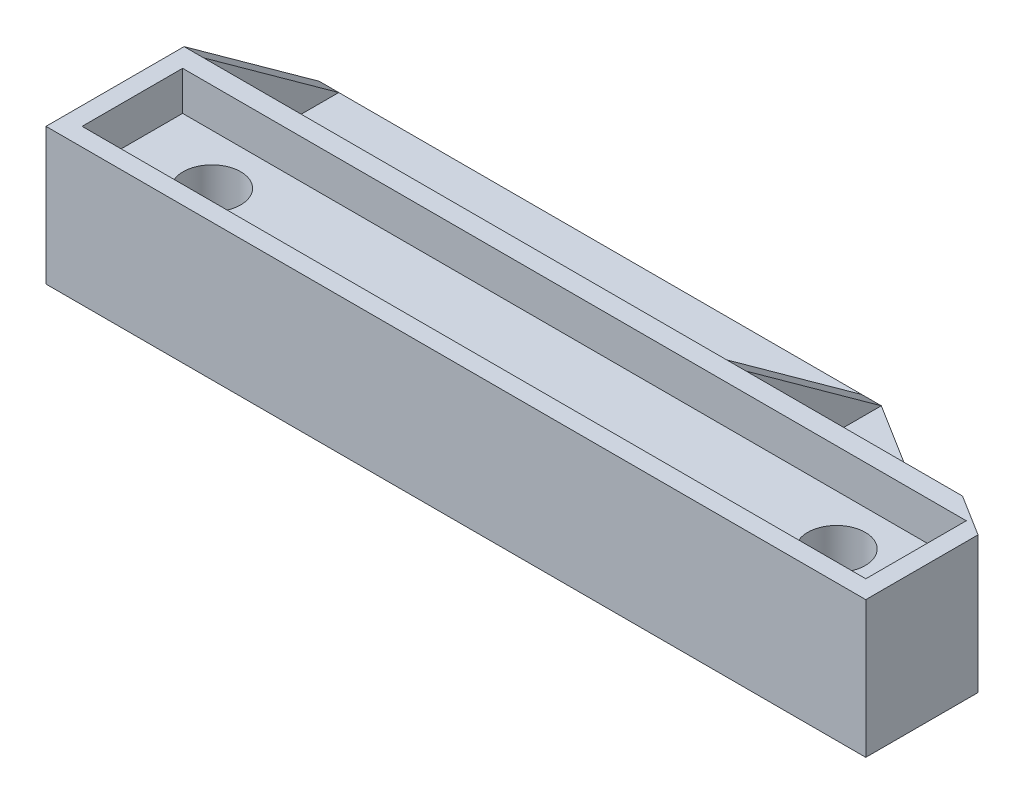
ISO-10303-21;
HEADER;
FILE_DESCRIPTION(('STEP AP214'),'2;1');
FILE_NAME('part.step','',(''),(''),'','','');
FILE_SCHEMA(('AUTOMOTIVE_DESIGN { 1 0 10303 214 1 1 1 1 }'));
ENDSEC;
DATA;
#1=APPLICATION_CONTEXT('core data for automotive mechanical design processes');
#2=APPLICATION_PROTOCOL_DEFINITION('international standard','automotive_design',2000,#1);
#3=PRODUCT_CONTEXT('',#1,'mechanical');
#4=PRODUCT('Part','Part','',(#3));
#5=PRODUCT_RELATED_PRODUCT_CATEGORY('part','',(#4));
#6=PRODUCT_DEFINITION_FORMATION('','',#4);
#7=PRODUCT_DEFINITION_CONTEXT('part definition',#1,'design');
#8=PRODUCT_DEFINITION('design','',#6,#7);
#9=PRODUCT_DEFINITION_SHAPE('','',#8);
#10=(LENGTH_UNIT() NAMED_UNIT(*) SI_UNIT(.MILLI.,.METRE.));
#11=(NAMED_UNIT(*) PLANE_ANGLE_UNIT() SI_UNIT($,.RADIAN.));
#12=(NAMED_UNIT(*) SI_UNIT($,.STERADIAN.) SOLID_ANGLE_UNIT());
#13=UNCERTAINTY_MEASURE_WITH_UNIT(LENGTH_MEASURE(1.E-05),#10,'distance_accuracy_value','');
#14=(GEOMETRIC_REPRESENTATION_CONTEXT(3) GLOBAL_UNCERTAINTY_ASSIGNED_CONTEXT((#13)) GLOBAL_UNIT_ASSIGNED_CONTEXT((#10,
#11,#12)) REPRESENTATION_CONTEXT('',''));
#15=CARTESIAN_POINT('',(0.,0.,0.));
#16=DIRECTION('',(0.,0.,1.));
#17=DIRECTION('',(1.,0.,0.));
#18=AXIS2_PLACEMENT_3D('',#15,#16,#17);
#19=CARTESIAN_POINT('',(5.,7.,-3.49999999993633));
#20=DIRECTION('',(0.,-1.,0.));
#21=DIRECTION('',(0.,0.,-1.));
#22=AXIS2_PLACEMENT_3D('',#19,#20,#21);
#23=CYLINDRICAL_SURFACE('',#22,1.47500000000001);
#24=CARTESIAN_POINT('',(5.,0.,-3.49999999993633));
#25=DIRECTION('',(0.,-1.,0.));
#26=DIRECTION('',(0.,0.,1.));
#27=AXIS2_PLACEMENT_3D('',#24,#25,#26);
#28=CIRCLE('',#27,1.47500000000001);
#29=CARTESIAN_POINT('',(5.,0.,-2.02499999993633));
#30=VERTEX_POINT('',#29);
#31=EDGE_CURVE('E245',#30,#30,#28,.T.);
#32=ORIENTED_EDGE('',*,*,#31,.T.);
#33=EDGE_LOOP('',(#32));
#34=FACE_BOUND('',#33,.T.);
#35=CARTESIAN_POINT('',(5.,5.,-3.49999999993633));
#36=DIRECTION('',(0.,1.,0.));
#37=DIRECTION('',(0.,0.,1.));
#38=AXIS2_PLACEMENT_3D('',#35,#36,#37);
#39=CIRCLE('',#38,1.47500000000001);
#40=CARTESIAN_POINT('',(5.,5.,-2.02499999993633));
#41=VERTEX_POINT('',#40);
#42=EDGE_CURVE('E241',#41,#41,#39,.F.);
#43=ORIENTED_EDGE('',*,*,#42,.F.);
#44=EDGE_LOOP('',(#43));
#45=FACE_BOUND('',#44,.T.);
#46=ADVANCED_FACE('F45',(#34,#45),#23,.F.);
#47=CARTESIAN_POINT('',(37.,7.,-3.49999999993633));
#48=DIRECTION('',(0.,-1.,0.));
#49=DIRECTION('',(0.,0.,-1.));
#50=AXIS2_PLACEMENT_3D('',#47,#48,#49);
#51=CYLINDRICAL_SURFACE('',#50,1.47500000000001);
#52=CARTESIAN_POINT('',(37.,0.,-3.49999999993633));
#53=DIRECTION('',(0.,-1.,0.));
#54=DIRECTION('',(0.,0.,-1.));
#55=AXIS2_PLACEMENT_3D('',#52,#53,#54);
#56=CIRCLE('',#55,1.47500000000001);
#57=CARTESIAN_POINT('',(37.,0.,-4.97499999993634));
#58=VERTEX_POINT('',#57);
#59=EDGE_CURVE('E246',#58,#58,#56,.T.);
#60=ORIENTED_EDGE('',*,*,#59,.T.);
#61=EDGE_LOOP('',(#60));
#62=FACE_BOUND('',#61,.T.);
#63=CARTESIAN_POINT('',(37.,5.,-3.49999999993633));
#64=DIRECTION('',(0.,1.,0.));
#65=DIRECTION('',(0.,0.,1.));
#66=AXIS2_PLACEMENT_3D('',#63,#64,#65);
#67=CIRCLE('',#66,1.47500000000001);
#68=CARTESIAN_POINT('',(37.,5.,-2.02499999993633));
#69=VERTEX_POINT('',#68);
#70=EDGE_CURVE('E231',#69,#69,#67,.F.);
#71=ORIENTED_EDGE('',*,*,#70,.F.);
#72=EDGE_LOOP('',(#71));
#73=FACE_BOUND('',#72,.T.);
#74=ADVANCED_FACE('F338',(#62,#73),#51,.F.);
#75=CARTESIAN_POINT('',(42.,7.,-5.75));
#76=DIRECTION('',(-1.,0.,0.));
#77=DIRECTION('',(0.,0.,1.));
#78=AXIS2_PLACEMENT_3D('',#75,#76,#77);
#79=PLANE('',#78);
#80=DIRECTION('',(0.,0.,-1.));
#81=VECTOR('',#80,1.);
#82=CARTESIAN_POINT('',(42.,0.,-5.75));
#83=LINE('',#82,#81);
#84=CARTESIAN_POINT('',(42.,0.,0.));
#85=VERTEX_POINT('',#84);
#86=CARTESIAN_POINT('',(42.,0.,-5.75));
#87=VERTEX_POINT('',#86);
#88=EDGE_CURVE('E250',#85,#87,#83,.T.);
#89=ORIENTED_EDGE('',*,*,#88,.T.);
#90=DIRECTION('',(0.,-1.,0.));
#91=VECTOR('',#90,1.);
#92=CARTESIAN_POINT('',(42.,7.,-5.75));
#93=LINE('',#92,#91);
#94=CARTESIAN_POINT('',(42.,7.,-5.75));
#95=VERTEX_POINT('',#94);
#96=EDGE_CURVE('E288',#95,#87,#93,.T.);
#97=ORIENTED_EDGE('',*,*,#96,.F.);
#98=DIRECTION('',(0.,0.,-1.));
#99=VECTOR('',#98,1.);
#100=CARTESIAN_POINT('',(42.,7.,-5.75));
#101=LINE('',#100,#99);
#102=CARTESIAN_POINT('',(42.,7.,0.));
#103=VERTEX_POINT('',#102);
#104=EDGE_CURVE('E254',#103,#95,#101,.T.);
#105=ORIENTED_EDGE('',*,*,#104,.F.);
#106=DIRECTION('',(0.,-1.,0.));
#107=VECTOR('',#106,1.);
#108=CARTESIAN_POINT('',(42.,7.,0.));
#109=LINE('',#108,#107);
#110=EDGE_CURVE('E268',#103,#85,#109,.T.);
#111=ORIENTED_EDGE('',*,*,#110,.T.);
#112=EDGE_LOOP('',(#89,#97,#105,#111));
#113=FACE_BOUND('',#112,.T.);
#114=ADVANCED_FACE('F344',(#113),#79,.F.);
#115=CARTESIAN_POINT('',(39.9995818389024,7.,-6.99999999987266));
#116=DIRECTION('',(-0.5299192642332,0.,0.848048096156429));
#117=DIRECTION('',(0.848048096156429,0.,0.5299192642332));
#118=AXIS2_PLACEMENT_3D('',#115,#116,#117);
#119=PLANE('',#118);
#120=DIRECTION('',(-0.848048096156429,0.,-0.5299192642332));
#121=VECTOR('',#120,1.);
#122=CARTESIAN_POINT('',(39.8795567492244,2.,-7.07499999987266));
#123=LINE('',#122,#121);
#124=CARTESIAN_POINT('',(38.2792222201833,2.,-8.07499999987267));
#125=VERTEX_POINT('',#124);
#126=CARTESIAN_POINT('',(28.7972401356149,2.,-13.9999999998727));
#127=VERTEX_POINT('',#126);
#128=EDGE_CURVE('E327',#125,#127,#123,.T.);
#129=ORIENTED_EDGE('',*,*,#128,.F.);
#130=DIRECTION('',(0.74933734663282,0.468237942151893,0.468237942151899));
#131=VECTOR('',#130,1.);
#132=CARTESIAN_POINT('',(41.3767394342747,3.93554357409725,-6.13945642577539));
#133=LINE('',#132,#131);
#134=CARTESIAN_POINT('',(39.8795567492244,2.99999999999999,-7.07499999987266));
#135=VERTEX_POINT('',#134);
#136=EDGE_CURVE('E11',#125,#135,#133,.T.);
#137=ORIENTED_EDGE('',*,*,#136,.T.);
#138=DIRECTION('',(0.,1.,0.));
#139=VECTOR('',#138,1.);
#140=CARTESIAN_POINT('',(39.8795567492244,2.,-7.07499999987266));
#141=LINE('',#140,#139);
#142=CARTESIAN_POINT('',(39.8795567492244,7.,-7.07499999987266));
#143=VERTEX_POINT('',#142);
#144=EDGE_CURVE('E383',#135,#143,#141,.T.);
#145=ORIENTED_EDGE('',*,*,#144,.T.);
#146=DIRECTION('',(-0.848048096156429,0.,-0.5299192642332));
#147=VECTOR('',#146,1.);
#148=CARTESIAN_POINT('',(39.9995818389024,7.,-6.99999999987266));
#149=LINE('',#148,#147);
#150=EDGE_CURVE('E258',#95,#143,#149,.T.);
#151=ORIENTED_EDGE('',*,*,#150,.F.);
#152=ORIENTED_EDGE('',*,*,#96,.T.);
#153=DIRECTION('',(-0.848048096156429,0.,-0.5299192642332));
#154=VECTOR('',#153,1.);
#155=CARTESIAN_POINT('',(39.9995818389024,0.,-6.99999999987266));
#156=LINE('',#155,#154);
#157=CARTESIAN_POINT('',(28.7972401356149,0.,-13.9999999998727));
#158=VERTEX_POINT('',#157);
#159=EDGE_CURVE('E272',#87,#158,#156,.T.);
#160=ORIENTED_EDGE('',*,*,#159,.T.);
#161=DIRECTION('',(0.,-1.,0.));
#162=VECTOR('',#161,1.);
#163=CARTESIAN_POINT('',(28.7972401356149,7.,-13.9999999998727));
#164=LINE('',#163,#162);
#165=EDGE_CURVE('E189',#127,#158,#164,.T.);
#166=ORIENTED_EDGE('',*,*,#165,.F.);
#167=EDGE_LOOP('',(#129,#137,#145,#151,#152,#160,#166));
#168=FACE_BOUND('',#167,.T.);
#169=ADVANCED_FACE('F365',(#168),#119,.F.);
#170=CARTESIAN_POINT('',(0.,7.,-6.99999999987266));
#171=DIRECTION('',(1.,0.,0.));
#172=DIRECTION('',(0.,0.,-1.));
#173=AXIS2_PLACEMENT_3D('',#170,#171,#172);
#174=PLANE('',#173);
#175=DIRECTION('',(0.,0.,1.));
#176=VECTOR('',#175,1.);
#177=CARTESIAN_POINT('',(0.,7.,-6.99999999987266));
#178=LINE('',#177,#176);
#179=CARTESIAN_POINT('',(0.,7.,-7.07499999987266));
#180=VERTEX_POINT('',#179);
#181=CARTESIAN_POINT('',(0.,7.,0.));
#182=VERTEX_POINT('',#181);
#183=EDGE_CURVE('E181',#180,#182,#178,.T.);
#184=ORIENTED_EDGE('',*,*,#183,.F.);
#185=DIRECTION('',(0.,0.585383683581828,0.810756401760831));
#186=VECTOR('',#185,1.);
#187=CARTESIAN_POINT('',(0.,7.,-7.07499999987266));
#188=LINE('',#187,#186);
#189=CARTESIAN_POINT('',(0.,2.,-13.9999999998727));
#190=VERTEX_POINT('',#189);
#191=EDGE_CURVE('E164',#190,#180,#188,.T.);
#192=ORIENTED_EDGE('',*,*,#191,.F.);
#193=DIRECTION('',(0.,-1.,0.));
#194=VECTOR('',#193,1.);
#195=CARTESIAN_POINT('',(0.,7.,-13.9999999998727));
#196=LINE('',#195,#194);
#197=CARTESIAN_POINT('',(0.,0.,-13.9999999998727));
#198=VERTEX_POINT('',#197);
#199=EDGE_CURVE('E178',#190,#198,#196,.T.);
#200=ORIENTED_EDGE('',*,*,#199,.T.);
#201=DIRECTION('',(0.,0.,1.));
#202=VECTOR('',#201,1.);
#203=CARTESIAN_POINT('',(0.,0.,-6.99999999987266));
#204=LINE('',#203,#202);
#205=CARTESIAN_POINT('',(0.,0.,0.));
#206=VERTEX_POINT('',#205);
#207=EDGE_CURVE('E276',#198,#206,#204,.T.);
#208=ORIENTED_EDGE('',*,*,#207,.T.);
#209=DIRECTION('',(0.,-1.,0.));
#210=VECTOR('',#209,1.);
#211=CARTESIAN_POINT('',(0.,7.,0.));
#212=LINE('',#211,#210);
#213=EDGE_CURVE('E284',#182,#206,#212,.T.);
#214=ORIENTED_EDGE('',*,*,#213,.F.);
#215=EDGE_LOOP('',(#184,#192,#200,#208,#214));
#216=FACE_BOUND('',#215,.T.);
#217=ADVANCED_FACE('F177',(#216),#174,.F.);
#218=CARTESIAN_POINT('',(0.,7.,0.));
#219=DIRECTION('',(0.,0.,-1.));
#220=DIRECTION('',(-1.,0.,0.));
#221=AXIS2_PLACEMENT_3D('',#218,#219,#220);
#222=PLANE('',#221);
#223=DIRECTION('',(1.,0.,0.));
#224=VECTOR('',#223,1.);
#225=CARTESIAN_POINT('',(0.,0.,0.));
#226=LINE('',#225,#224);
#227=EDGE_CURVE('E259',#206,#85,#226,.T.);
#228=ORIENTED_EDGE('',*,*,#227,.T.);
#229=ORIENTED_EDGE('',*,*,#110,.F.);
#230=DIRECTION('',(1.,0.,0.));
#231=VECTOR('',#230,1.);
#232=CARTESIAN_POINT('',(0.,7.,0.));
#233=LINE('',#232,#231);
#234=EDGE_CURVE('E265',#182,#103,#233,.T.);
#235=ORIENTED_EDGE('',*,*,#234,.F.);
#236=ORIENTED_EDGE('',*,*,#213,.T.);
#237=EDGE_LOOP('',(#228,#229,#235,#236));
#238=FACE_BOUND('',#237,.T.);
#239=ADVANCED_FACE('F354',(#238),#222,.F.);
#240=CARTESIAN_POINT('',(0.,7.,0.));
#241=DIRECTION('',(0.,1.,0.));
#242=DIRECTION('',(0.,0.,1.));
#243=AXIS2_PLACEMENT_3D('',#240,#241,#242);
#244=PLANE('',#243);
#245=DIRECTION('',(-1.,0.,0.));
#246=VECTOR('',#245,1.);
#247=CARTESIAN_POINT('',(42.,7.,-7.07499999987266));
#248=LINE('',#247,#246);
#249=CARTESIAN_POINT('',(1.,7.,-7.07499999987266));
#250=VERTEX_POINT('',#249);
#251=EDGE_CURVE('E389',#250,#180,#248,.T.);
#252=ORIENTED_EDGE('',*,*,#251,.T.);
#253=ORIENTED_EDGE('',*,*,#183,.T.);
#254=ORIENTED_EDGE('',*,*,#234,.T.);
#255=ORIENTED_EDGE('',*,*,#104,.T.);
#256=ORIENTED_EDGE('',*,*,#150,.T.);
#257=DIRECTION('',(1.,0.,0.));
#258=VECTOR('',#257,1.);
#259=CARTESIAN_POINT('',(28.7972401356149,7.,-7.07499999987266));
#260=LINE('',#259,#258);
#261=CARTESIAN_POINT('',(28.7972401356149,7.,-7.07499999987266));
#262=VERTEX_POINT('',#261);
#263=EDGE_CURVE('E422',#262,#143,#260,.T.);
#264=ORIENTED_EDGE('',*,*,#263,.F.);
#265=CARTESIAN_POINT('',(27.7972401356169,7.,-7.07499999987266));
#266=VERTEX_POINT('',#265);
#267=EDGE_CURVE('E394',#262,#266,#248,.T.);
#268=ORIENTED_EDGE('',*,*,#267,.T.);
#269=DIRECTION('',(1.,0.,0.));
#270=VECTOR('',#269,1.);
#271=CARTESIAN_POINT('',(27.7972401356169,7.,-7.07499999987266));
#272=LINE('',#271,#270);
#273=EDGE_CURVE('E392',#250,#266,#272,.T.);
#274=ORIENTED_EDGE('',*,*,#273,.F.);
#275=EDGE_LOOP('',(#252,#253,#254,#255,#256,#264,#268,#274));
#276=FACE_BOUND('',#275,.T.);
#277=DIRECTION('',(0.,0.,1.));
#278=VECTOR('',#277,1.);
#279=CARTESIAN_POINT('',(0.925,7.,-6.07499999987266));
#280=LINE('',#279,#278);
#281=CARTESIAN_POINT('',(0.925,7.,-6.07499999987266));
#282=VERTEX_POINT('',#281);
#283=CARTESIAN_POINT('',(0.925000000000001,7.,-0.924999999872661));
#284=VERTEX_POINT('',#283);
#285=EDGE_CURVE('E193',#282,#284,#280,.T.);
#286=ORIENTED_EDGE('',*,*,#285,.F.);
#287=DIRECTION('',(1.,0.,0.));
#288=VECTOR('',#287,1.);
#289=CARTESIAN_POINT('',(0.925,7.,-6.07499999987266));
#290=LINE('',#289,#288);
#291=CARTESIAN_POINT('',(41.075,7.,-6.07499999987266));
#292=VERTEX_POINT('',#291);
#293=EDGE_CURVE('E204',#282,#292,#290,.T.);
#294=ORIENTED_EDGE('',*,*,#293,.T.);
#295=DIRECTION('',(0.,0.,1.));
#296=VECTOR('',#295,1.);
#297=CARTESIAN_POINT('',(41.075,7.,-6.07499999987266));
#298=LINE('',#297,#296);
#299=CARTESIAN_POINT('',(41.075,7.,-0.924999999872661));
#300=VERTEX_POINT('',#299);
#301=EDGE_CURVE('E221',#292,#300,#298,.T.);
#302=ORIENTED_EDGE('',*,*,#301,.T.);
#303=DIRECTION('',(1.,0.,0.));
#304=VECTOR('',#303,1.);
#305=CARTESIAN_POINT('',(0.925000000000001,7.,-0.924999999872661));
#306=LINE('',#305,#304);
#307=EDGE_CURVE('E217',#284,#300,#306,.T.);
#308=ORIENTED_EDGE('',*,*,#307,.F.);
#309=EDGE_LOOP('',(#286,#294,#302,#308));
#310=FACE_BOUND('',#309,.T.);
#311=ADVANCED_FACE('F350',(#276,#310),#244,.T.);
#312=CARTESIAN_POINT('',(0.,0.,0.));
#313=DIRECTION('',(0.,1.,0.));
#314=DIRECTION('',(0.,0.,1.));
#315=AXIS2_PLACEMENT_3D('',#312,#313,#314);
#316=PLANE('',#315);
#317=ORIENTED_EDGE('',*,*,#59,.F.);
#318=EDGE_LOOP('',(#317));
#319=FACE_BOUND('',#318,.T.);
#320=ORIENTED_EDGE('',*,*,#31,.F.);
#321=EDGE_LOOP('',(#320));
#322=FACE_BOUND('',#321,.T.);
#323=ORIENTED_EDGE('',*,*,#88,.F.);
#324=ORIENTED_EDGE('',*,*,#227,.F.);
#325=ORIENTED_EDGE('',*,*,#207,.F.);
#326=DIRECTION('',(-1.,0.,0.));
#327=VECTOR('',#326,1.);
#328=CARTESIAN_POINT('',(28.7972401356149,0.,-13.9999999998727));
#329=LINE('',#328,#327);
#330=EDGE_CURVE('E187',#158,#198,#329,.T.);
#331=ORIENTED_EDGE('',*,*,#330,.F.);
#332=ORIENTED_EDGE('',*,*,#159,.F.);
#333=EDGE_LOOP('',(#323,#324,#325,#331,#332));
#334=FACE_BOUND('',#333,.T.);
#335=ADVANCED_FACE('F353',(#319,#322,#334),#316,.F.);
#336=CARTESIAN_POINT('',(0.,5.,0.));
#337=DIRECTION('',(0.,1.,0.));
#338=DIRECTION('',(0.,0.,1.));
#339=AXIS2_PLACEMENT_3D('',#336,#337,#338);
#340=PLANE('',#339);
#341=DIRECTION('',(0.,0.,1.));
#342=VECTOR('',#341,1.);
#343=CARTESIAN_POINT('',(0.925,5.,-6.07499999987266));
#344=LINE('',#343,#342);
#345=CARTESIAN_POINT('',(0.925,5.,-6.07499999987266));
#346=VERTEX_POINT('',#345);
#347=CARTESIAN_POINT('',(0.925000000000001,5.,-0.924999999872661));
#348=VERTEX_POINT('',#347);
#349=EDGE_CURVE('E199',#346,#348,#344,.T.);
#350=ORIENTED_EDGE('',*,*,#349,.T.);
#351=DIRECTION('',(1.,0.,0.));
#352=VECTOR('',#351,1.);
#353=CARTESIAN_POINT('',(0.925000000000001,5.,-0.924999999872661));
#354=LINE('',#353,#352);
#355=CARTESIAN_POINT('',(41.075,5.,-0.924999999872661));
#356=VERTEX_POINT('',#355);
#357=EDGE_CURVE('E203',#348,#356,#354,.T.);
#358=ORIENTED_EDGE('',*,*,#357,.T.);
#359=DIRECTION('',(0.,0.,1.));
#360=VECTOR('',#359,1.);
#361=CARTESIAN_POINT('',(41.075,5.,-6.07499999987266));
#362=LINE('',#361,#360);
#363=CARTESIAN_POINT('',(41.075,5.,-6.07499999987266));
#364=VERTEX_POINT('',#363);
#365=EDGE_CURVE('E208',#364,#356,#362,.T.);
#366=ORIENTED_EDGE('',*,*,#365,.F.);
#367=DIRECTION('',(1.,0.,0.));
#368=VECTOR('',#367,1.);
#369=CARTESIAN_POINT('',(0.925,5.,-6.07499999987266));
#370=LINE('',#369,#368);
#371=EDGE_CURVE('E211',#346,#364,#370,.T.);
#372=ORIENTED_EDGE('',*,*,#371,.F.);
#373=EDGE_LOOP('',(#350,#358,#366,#372));
#374=FACE_BOUND('',#373,.T.);
#375=ORIENTED_EDGE('',*,*,#70,.T.);
#376=EDGE_LOOP('',(#375));
#377=FACE_BOUND('',#376,.T.);
#378=ORIENTED_EDGE('',*,*,#42,.T.);
#379=EDGE_LOOP('',(#378));
#380=FACE_BOUND('',#379,.T.);
#381=ADVANCED_FACE('F358',(#374,#377,#380),#340,.T.);
#382=CARTESIAN_POINT('',(0.925,5.,-6.07499999987266));
#383=DIRECTION('',(-1.,0.,0.));
#384=DIRECTION('',(0.,0.,1.));
#385=AXIS2_PLACEMENT_3D('',#382,#383,#384);
#386=PLANE('',#385);
#387=ORIENTED_EDGE('',*,*,#285,.T.);
#388=DIRECTION('',(0.,1.,0.));
#389=VECTOR('',#388,1.);
#390=CARTESIAN_POINT('',(0.925000000000001,5.,-0.924999999872661));
#391=LINE('',#390,#389);
#392=EDGE_CURVE('E214',#348,#284,#391,.T.);
#393=ORIENTED_EDGE('',*,*,#392,.F.);
#394=ORIENTED_EDGE('',*,*,#349,.F.);
#395=DIRECTION('',(0.,1.,0.));
#396=VECTOR('',#395,1.);
#397=CARTESIAN_POINT('',(0.925,5.,-6.07499999987266));
#398=LINE('',#397,#396);
#399=EDGE_CURVE('E228',#346,#282,#398,.T.);
#400=ORIENTED_EDGE('',*,*,#399,.T.);
#401=EDGE_LOOP('',(#387,#393,#394,#400));
#402=FACE_BOUND('',#401,.T.);
#403=ADVANCED_FACE('F479',(#402),#386,.F.);
#404=CARTESIAN_POINT('',(0.925,5.,-6.07499999987266));
#405=DIRECTION('',(0.,0.,1.));
#406=DIRECTION('',(1.,0.,0.));
#407=AXIS2_PLACEMENT_3D('',#404,#405,#406);
#408=PLANE('',#407);
#409=ORIENTED_EDGE('',*,*,#293,.F.);
#410=ORIENTED_EDGE('',*,*,#399,.F.);
#411=ORIENTED_EDGE('',*,*,#371,.T.);
#412=DIRECTION('',(0.,1.,0.));
#413=VECTOR('',#412,1.);
#414=CARTESIAN_POINT('',(41.075,5.,-6.07499999987266));
#415=LINE('',#414,#413);
#416=EDGE_CURVE('E232',#364,#292,#415,.T.);
#417=ORIENTED_EDGE('',*,*,#416,.T.);
#418=EDGE_LOOP('',(#409,#410,#411,#417));
#419=FACE_BOUND('',#418,.T.);
#420=ADVANCED_FACE('F481',(#419),#408,.T.);
#421=CARTESIAN_POINT('',(41.075,5.,-6.07499999987266));
#422=DIRECTION('',(-1.,0.,0.));
#423=DIRECTION('',(0.,0.,1.));
#424=AXIS2_PLACEMENT_3D('',#421,#422,#423);
#425=PLANE('',#424);
#426=ORIENTED_EDGE('',*,*,#301,.F.);
#427=ORIENTED_EDGE('',*,*,#416,.F.);
#428=ORIENTED_EDGE('',*,*,#365,.T.);
#429=DIRECTION('',(0.,1.,0.));
#430=VECTOR('',#429,1.);
#431=CARTESIAN_POINT('',(41.075,5.,-0.924999999872661));
#432=LINE('',#431,#430);
#433=EDGE_CURVE('E235',#356,#300,#432,.T.);
#434=ORIENTED_EDGE('',*,*,#433,.T.);
#435=EDGE_LOOP('',(#426,#427,#428,#434));
#436=FACE_BOUND('',#435,.T.);
#437=ADVANCED_FACE('F484',(#436),#425,.T.);
#438=CARTESIAN_POINT('',(0.925000000000001,5.,-0.924999999872661));
#439=DIRECTION('',(0.,0.,1.));
#440=DIRECTION('',(1.,0.,0.));
#441=AXIS2_PLACEMENT_3D('',#438,#439,#440);
#442=PLANE('',#441);
#443=ORIENTED_EDGE('',*,*,#307,.T.);
#444=ORIENTED_EDGE('',*,*,#433,.F.);
#445=ORIENTED_EDGE('',*,*,#357,.F.);
#446=ORIENTED_EDGE('',*,*,#392,.T.);
#447=EDGE_LOOP('',(#443,#444,#445,#446));
#448=FACE_BOUND('',#447,.T.);
#449=ADVANCED_FACE('F476',(#448),#442,.F.);
#450=CARTESIAN_POINT('',(28.7972401356149,7.,-13.9999999998727));
#451=DIRECTION('',(0.,0.,1.));
#452=DIRECTION('',(1.,0.,0.));
#453=AXIS2_PLACEMENT_3D('',#450,#451,#452);
#454=PLANE('',#453);
#455=ORIENTED_EDGE('',*,*,#199,.F.);
#456=DIRECTION('',(-1.,0.,0.));
#457=VECTOR('',#456,1.);
#458=CARTESIAN_POINT('',(42.,2.,-13.9999999998727));
#459=LINE('',#458,#457);
#460=CARTESIAN_POINT('',(1.,2.,-13.9999999998727));
#461=VERTEX_POINT('',#460);
#462=EDGE_CURVE('E160',#461,#190,#459,.T.);
#463=ORIENTED_EDGE('',*,*,#462,.F.);
#464=DIRECTION('',(-1.,0.,0.));
#465=VECTOR('',#464,1.);
#466=CARTESIAN_POINT('',(1.,2.,-13.9999999998727));
#467=LINE('',#466,#465);
#468=CARTESIAN_POINT('',(27.7972401356169,2.,-13.9999999998727));
#469=VERTEX_POINT('',#468);
#470=EDGE_CURVE('E412',#469,#461,#467,.T.);
#471=ORIENTED_EDGE('',*,*,#470,.F.);
#472=EDGE_CURVE('E173',#127,#469,#459,.T.);
#473=ORIENTED_EDGE('',*,*,#472,.F.);
#474=ORIENTED_EDGE('',*,*,#165,.T.);
#475=ORIENTED_EDGE('',*,*,#330,.T.);
#476=EDGE_LOOP('',(#455,#463,#471,#473,#474,#475));
#477=FACE_BOUND('',#476,.T.);
#478=ADVANCED_FACE('F185',(#477),#454,.F.);
#479=CARTESIAN_POINT('',(28.7972401356149,2.,-7.07499999987266));
#480=DIRECTION('',(0.,0.,1.));
#481=DIRECTION('',(1.,0.,0.));
#482=AXIS2_PLACEMENT_3D('',#479,#480,#481);
#483=PLANE('',#482);
#484=ORIENTED_EDGE('',*,*,#144,.F.);
#485=DIRECTION('',(-1.,0.,0.));
#486=VECTOR('',#485,1.);
#487=CARTESIAN_POINT('',(28.7972401356149,2.99999999999999,-7.07499999987266));
#488=LINE('',#487,#486);
#489=CARTESIAN_POINT('',(28.7972401356149,2.99999999999999,-7.07499999987266));
#490=VERTEX_POINT('',#489);
#491=EDGE_CURVE('E62',#135,#490,#488,.T.);
#492=ORIENTED_EDGE('',*,*,#491,.T.);
#493=DIRECTION('',(0.,1.,0.));
#494=VECTOR('',#493,1.);
#495=CARTESIAN_POINT('',(28.7972401356149,2.,-7.07499999987266));
#496=LINE('',#495,#494);
#497=EDGE_CURVE('E322',#490,#262,#496,.T.);
#498=ORIENTED_EDGE('',*,*,#497,.T.);
#499=ORIENTED_EDGE('',*,*,#263,.T.);
#500=EDGE_LOOP('',(#484,#492,#498,#499));
#501=FACE_BOUND('',#500,.T.);
#502=ADVANCED_FACE('F433',(#501),#483,.F.);
#503=CARTESIAN_POINT('',(28.7972401356149,2.,-13.9999999998727));
#504=DIRECTION('',(-1.,0.,0.));
#505=DIRECTION('',(0.,0.,1.));
#506=AXIS2_PLACEMENT_3D('',#503,#504,#505);
#507=PLANE('',#506);
#508=ORIENTED_EDGE('',*,*,#497,.F.);
#509=DIRECTION('',(0.,-0.707106781186543,-0.707106781186552));
#510=VECTOR('',#509,1.);
#511=CARTESIAN_POINT('',(28.7972401356149,2.,-8.07499999987267));
#512=LINE('',#511,#510);
#513=CARTESIAN_POINT('',(28.7972401356149,2.,-8.07499999987267));
#514=VERTEX_POINT('',#513);
#515=EDGE_CURVE('E55',#490,#514,#512,.T.);
#516=ORIENTED_EDGE('',*,*,#515,.T.);
#517=DIRECTION('',(0.,0.,1.));
#518=VECTOR('',#517,1.);
#519=CARTESIAN_POINT('',(28.7972401356149,2.,-13.9999999998727));
#520=LINE('',#519,#518);
#521=EDGE_CURVE('E320',#127,#514,#520,.T.);
#522=ORIENTED_EDGE('',*,*,#521,.F.);
#523=DIRECTION('',(0.,0.585383683581828,0.810756401760831));
#524=VECTOR('',#523,1.);
#525=CARTESIAN_POINT('',(28.7972401356149,2.,-13.9999999998727));
#526=LINE('',#525,#524);
#527=EDGE_CURVE('E406',#127,#262,#526,.T.);
#528=ORIENTED_EDGE('',*,*,#527,.T.);
#529=EDGE_LOOP('',(#508,#516,#522,#528));
#530=FACE_BOUND('',#529,.T.);
#531=ADVANCED_FACE('F318',(#530),#507,.F.);
#532=CARTESIAN_POINT('',(0.,2.,0.));
#533=DIRECTION('',(0.,1.,0.));
#534=DIRECTION('',(0.,0.,1.));
#535=AXIS2_PLACEMENT_3D('',#532,#533,#534);
#536=PLANE('',#535);
#537=ORIENTED_EDGE('',*,*,#521,.T.);
#538=DIRECTION('',(1.,0.,0.));
#539=VECTOR('',#538,1.);
#540=CARTESIAN_POINT('',(0.,2.,-8.07499999987267));
#541=LINE('',#540,#539);
#542=EDGE_CURVE('E308',#514,#125,#541,.T.);
#543=ORIENTED_EDGE('',*,*,#542,.T.);
#544=ORIENTED_EDGE('',*,*,#128,.T.);
#545=EDGE_LOOP('',(#537,#543,#544));
#546=FACE_BOUND('',#545,.T.);
#547=ADVANCED_FACE('F326',(#546),#536,.T.);
#548=CARTESIAN_POINT('',(27.7972401356169,2.,-7.07499999987266));
#549=DIRECTION('',(0.,0.,1.));
#550=DIRECTION('',(1.,0.,0.));
#551=AXIS2_PLACEMENT_3D('',#548,#549,#550);
#552=PLANE('',#551);
#553=DIRECTION('',(0.,1.,0.));
#554=VECTOR('',#553,1.);
#555=CARTESIAN_POINT('',(27.7972401356169,2.,-7.07499999987266));
#556=LINE('',#555,#554);
#557=CARTESIAN_POINT('',(27.7972401356169,2.99999999999999,-7.07499999987266));
#558=VERTEX_POINT('',#557);
#559=EDGE_CURVE('E419',#558,#266,#556,.T.);
#560=ORIENTED_EDGE('',*,*,#559,.F.);
#561=DIRECTION('',(-1.,0.,0.));
#562=VECTOR('',#561,1.);
#563=CARTESIAN_POINT('',(1.,2.99999999999999,-7.07499999987266));
#564=LINE('',#563,#562);
#565=CARTESIAN_POINT('',(1.,2.99999999999999,-7.07499999987266));
#566=VERTEX_POINT('',#565);
#567=EDGE_CURVE('E302',#558,#566,#564,.T.);
#568=ORIENTED_EDGE('',*,*,#567,.T.);
#569=DIRECTION('',(0.,1.,0.));
#570=VECTOR('',#569,1.);
#571=CARTESIAN_POINT('',(1.,2.,-7.07499999987266));
#572=LINE('',#571,#570);
#573=EDGE_CURVE('E195',#566,#250,#572,.T.);
#574=ORIENTED_EDGE('',*,*,#573,.T.);
#575=ORIENTED_EDGE('',*,*,#273,.T.);
#576=EDGE_LOOP('',(#560,#568,#574,#575));
#577=FACE_BOUND('',#576,.T.);
#578=ADVANCED_FACE('F439',(#577),#552,.F.);
#579=CARTESIAN_POINT('',(1.,2.,-7.07499999987266));
#580=DIRECTION('',(-1.,0.,0.));
#581=DIRECTION('',(0.,0.,1.));
#582=AXIS2_PLACEMENT_3D('',#579,#580,#581);
#583=PLANE('',#582);
#584=ORIENTED_EDGE('',*,*,#573,.F.);
#585=DIRECTION('',(0.,0.707106781186543,0.707106781186553));
#586=VECTOR('',#585,1.);
#587=CARTESIAN_POINT('',(1.,2.,-8.07499999987266));
#588=LINE('',#587,#586);
#589=CARTESIAN_POINT('',(1.,2.,-8.07499999987266));
#590=VERTEX_POINT('',#589);
#591=EDGE_CURVE('E305',#566,#590,#588,.F.);
#592=ORIENTED_EDGE('',*,*,#591,.T.);
#593=DIRECTION('',(0.,0.,1.));
#594=VECTOR('',#593,1.);
#595=CARTESIAN_POINT('',(1.,2.,-7.07499999987266));
#596=LINE('',#595,#594);
#597=EDGE_CURVE('E415',#461,#590,#596,.T.);
#598=ORIENTED_EDGE('',*,*,#597,.F.);
#599=DIRECTION('',(0.,0.585383683581828,0.810756401760831));
#600=VECTOR('',#599,1.);
#601=CARTESIAN_POINT('',(1.,5.28662971498086,-9.44801784462418));
#602=LINE('',#601,#600);
#603=EDGE_CURVE('E167',#461,#250,#602,.T.);
#604=ORIENTED_EDGE('',*,*,#603,.T.);
#605=EDGE_LOOP('',(#584,#592,#598,#604));
#606=FACE_BOUND('',#605,.T.);
#607=ADVANCED_FACE('F444',(#606),#583,.F.);
#608=CARTESIAN_POINT('',(27.7972401356169,2.,-13.9999999998727));
#609=DIRECTION('',(1.,0.,0.));
#610=DIRECTION('',(0.,0.,-1.));
#611=AXIS2_PLACEMENT_3D('',#608,#609,#610);
#612=PLANE('',#611);
#613=DIRECTION('',(0.,0.,-1.));
#614=VECTOR('',#613,1.);
#615=CARTESIAN_POINT('',(27.7972401356169,2.,-13.9999999998727));
#616=LINE('',#615,#614);
#617=CARTESIAN_POINT('',(27.7972401356169,2.,-8.07499999987267));
#618=VERTEX_POINT('',#617);
#619=EDGE_CURVE('E409',#618,#469,#616,.T.);
#620=ORIENTED_EDGE('',*,*,#619,.F.);
#621=DIRECTION('',(0.,-0.707106781186543,-0.707106781186553));
#622=VECTOR('',#621,1.);
#623=CARTESIAN_POINT('',(27.7972401356169,2.,-8.07499999987267));
#624=LINE('',#623,#622);
#625=EDGE_CURVE('E299',#618,#558,#624,.F.);
#626=ORIENTED_EDGE('',*,*,#625,.T.);
#627=ORIENTED_EDGE('',*,*,#559,.T.);
#628=DIRECTION('',(0.,-0.585383683581828,-0.810756401760831));
#629=VECTOR('',#628,1.);
#630=CARTESIAN_POINT('',(27.7972401356169,2.,-13.9999999998727));
#631=LINE('',#630,#629);
#632=EDGE_CURVE('E398',#266,#469,#631,.T.);
#633=ORIENTED_EDGE('',*,*,#632,.T.);
#634=EDGE_LOOP('',(#620,#626,#627,#633));
#635=FACE_BOUND('',#634,.T.);
#636=ADVANCED_FACE('F451',(#635),#612,.F.);
#637=CARTESIAN_POINT('',(0.,2.,0.));
#638=DIRECTION('',(0.,-1.,0.));
#639=DIRECTION('',(0.,0.,-1.));
#640=AXIS2_PLACEMENT_3D('',#637,#638,#639);
#641=PLANE('',#640);
#642=ORIENTED_EDGE('',*,*,#597,.T.);
#643=DIRECTION('',(1.,0.,0.));
#644=VECTOR('',#643,1.);
#645=CARTESIAN_POINT('',(27.7972401356169,2.,-8.07499999987267));
#646=LINE('',#645,#644);
#647=EDGE_CURVE('E292',#590,#618,#646,.T.);
#648=ORIENTED_EDGE('',*,*,#647,.T.);
#649=ORIENTED_EDGE('',*,*,#619,.T.);
#650=ORIENTED_EDGE('',*,*,#470,.T.);
#651=EDGE_LOOP('',(#642,#648,#649,#650));
#652=FACE_BOUND('',#651,.T.);
#653=ADVANCED_FACE('F449',(#652),#641,.F.);
#654=CARTESIAN_POINT('',(42.,7.,-7.07499999987266));
#655=DIRECTION('',(0.,-0.810756401760831,0.585383683581828));
#656=DIRECTION('',(0.,-0.585383683581828,-0.810756401760831));
#657=AXIS2_PLACEMENT_3D('',#654,#655,#656);
#658=PLANE('',#657);
#659=ORIENTED_EDGE('',*,*,#472,.T.);
#660=ORIENTED_EDGE('',*,*,#632,.F.);
#661=ORIENTED_EDGE('',*,*,#267,.F.);
#662=ORIENTED_EDGE('',*,*,#527,.F.);
#663=EDGE_LOOP('',(#659,#660,#661,#662));
#664=FACE_BOUND('',#663,.T.);
#665=ADVANCED_FACE('F453',(#664),#658,.F.);
#666=ORIENTED_EDGE('',*,*,#462,.T.);
#667=ORIENTED_EDGE('',*,*,#191,.T.);
#668=ORIENTED_EDGE('',*,*,#251,.F.);
#669=ORIENTED_EDGE('',*,*,#603,.F.);
#670=EDGE_LOOP('',(#666,#667,#668,#669));
#671=FACE_BOUND('',#670,.T.);
#672=ADVANCED_FACE('F162',(#671),#658,.F.);
#673=CARTESIAN_POINT('',(0.,2.,-8.07499999987266));
#674=DIRECTION('',(0.,0.707106781186553,-0.707106781186543));
#675=DIRECTION('',(-1.,0.,0.));
#676=AXIS2_PLACEMENT_3D('',#673,#674,#675);
#677=PLANE('',#676);
#678=ORIENTED_EDGE('',*,*,#591,.F.);
#679=ORIENTED_EDGE('',*,*,#567,.F.);
#680=ORIENTED_EDGE('',*,*,#625,.F.);
#681=ORIENTED_EDGE('',*,*,#647,.F.);
#682=EDGE_LOOP('',(#678,#679,#680,#681));
#683=FACE_BOUND('',#682,.T.);
#684=ADVANCED_FACE('F332',(#683),#677,.T.);
#685=CARTESIAN_POINT('',(0.,2.,-8.07499999987267));
#686=DIRECTION('',(0.,-0.707106781186552,0.707106781186543));
#687=DIRECTION('',(1.,0.,0.));
#688=AXIS2_PLACEMENT_3D('',#685,#686,#687);
#689=PLANE('',#688);
#690=ORIENTED_EDGE('',*,*,#515,.F.);
#691=ORIENTED_EDGE('',*,*,#491,.F.);
#692=ORIENTED_EDGE('',*,*,#136,.F.);
#693=ORIENTED_EDGE('',*,*,#542,.F.);
#694=EDGE_LOOP('',(#690,#691,#692,#693));
#695=FACE_BOUND('',#694,.T.);
#696=ADVANCED_FACE('F48',(#695),#689,.F.);
#697=CLOSED_SHELL('',(#46,#74,#114,#169,#217,#239,#311,#335,#381,#403,#420,#437,#449,#478,#502,
#531,#547,#578,#607,#636,#653,#665,#672,#684,#696));
#698=MANIFOLD_SOLID_BREP('B2',#697);
#699=ADVANCED_BREP_SHAPE_REPRESENTATION('',(#18,#698),#14);
#700=SHAPE_DEFINITION_REPRESENTATION(#9,#699);
ENDSEC;
END-ISO-10303-21;
